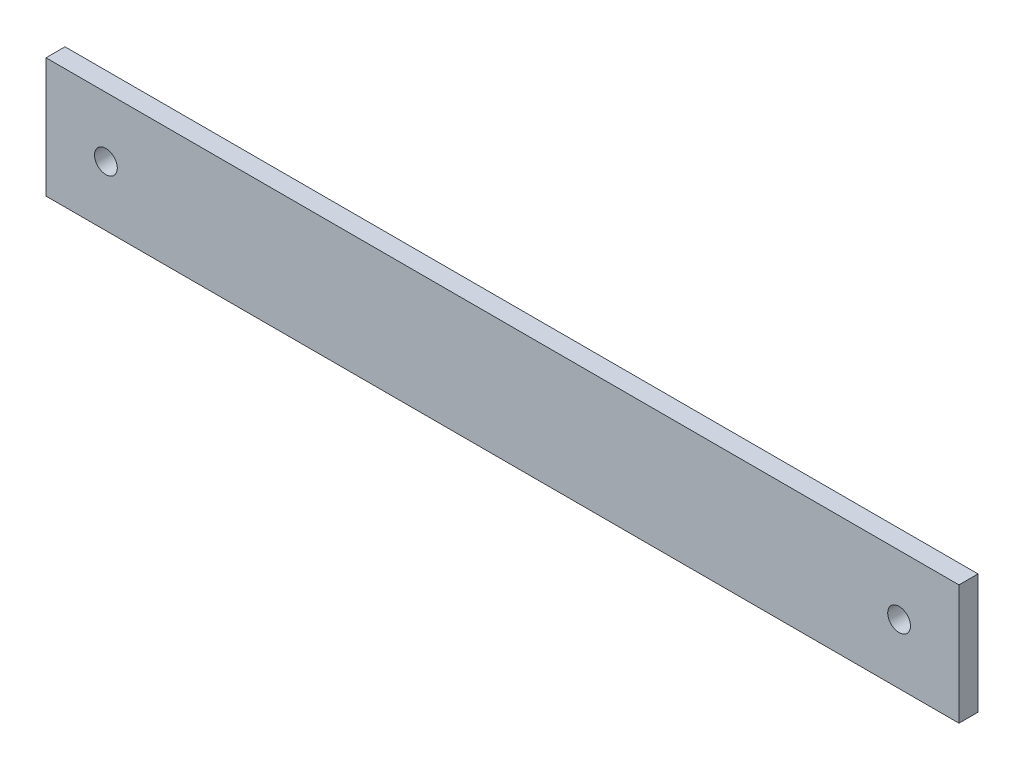
ISO-10303-21;
HEADER;
FILE_DESCRIPTION(('STEP AP214'),'2;1');
FILE_NAME('part.step','',(''),(''),'','','');
FILE_SCHEMA(('AUTOMOTIVE_DESIGN { 1 0 10303 214 1 1 1 1 }'));
ENDSEC;
DATA;
#1=APPLICATION_CONTEXT('core data for automotive mechanical design processes');
#2=APPLICATION_PROTOCOL_DEFINITION('international standard','automotive_design',2000,#1);
#3=PRODUCT_CONTEXT('',#1,'mechanical');
#4=PRODUCT('Part','Part','',(#3));
#5=PRODUCT_RELATED_PRODUCT_CATEGORY('part','',(#4));
#6=PRODUCT_DEFINITION_FORMATION('','',#4);
#7=PRODUCT_DEFINITION_CONTEXT('part definition',#1,'design');
#8=PRODUCT_DEFINITION('design','',#6,#7);
#9=PRODUCT_DEFINITION_SHAPE('','',#8);
#10=(LENGTH_UNIT() NAMED_UNIT(*) SI_UNIT(.MILLI.,.METRE.));
#11=(NAMED_UNIT(*) PLANE_ANGLE_UNIT() SI_UNIT($,.RADIAN.));
#12=(NAMED_UNIT(*) SI_UNIT($,.STERADIAN.) SOLID_ANGLE_UNIT());
#13=UNCERTAINTY_MEASURE_WITH_UNIT(LENGTH_MEASURE(1.E-05),#10,'distance_accuracy_value','');
#14=(GEOMETRIC_REPRESENTATION_CONTEXT(3) GLOBAL_UNCERTAINTY_ASSIGNED_CONTEXT((#13)) GLOBAL_UNIT_ASSIGNED_CONTEXT((#10,
#11,#12)) REPRESENTATION_CONTEXT('',''));
#15=CARTESIAN_POINT('',(0.,0.,0.));
#16=DIRECTION('',(0.,0.,1.));
#17=DIRECTION('',(1.,0.,0.));
#18=AXIS2_PLACEMENT_3D('',#15,#16,#17);
#19=CARTESIAN_POINT('',(0.,0.,3.175));
#20=DIRECTION('',(0.,0.,-1.));
#21=DIRECTION('',(-1.,0.,0.));
#22=AXIS2_PLACEMENT_3D('',#19,#20,#21);
#23=PLANE('',#22);
#24=CARTESIAN_POINT('',(142.4,10.,3.175));
#25=DIRECTION('',(0.,0.,-1.));
#26=DIRECTION('',(-1.,0.,0.));
#27=AXIS2_PLACEMENT_3D('',#24,#25,#26);
#28=CIRCLE('',#27,1.89865);
#29=CARTESIAN_POINT('',(140.50135,10.,3.175));
#30=VERTEX_POINT('',#29);
#31=EDGE_CURVE('E114',#30,#30,#28,.F.);
#32=ORIENTED_EDGE('',*,*,#31,.F.);
#33=EDGE_LOOP('',(#32));
#34=FACE_BOUND('',#33,.T.);
#35=DIRECTION('',(0.,-1.,0.));
#36=VECTOR('',#35,1.);
#37=CARTESIAN_POINT('',(0.,0.,3.175));
#38=LINE('',#37,#36);
#39=CARTESIAN_POINT('',(0.,20.,3.175));
#40=VERTEX_POINT('',#39);
#41=CARTESIAN_POINT('',(0.,0.,3.175));
#42=VERTEX_POINT('',#41);
#43=EDGE_CURVE('E85',#40,#42,#38,.T.);
#44=ORIENTED_EDGE('',*,*,#43,.T.);
#45=DIRECTION('',(1.,0.,0.));
#46=VECTOR('',#45,1.);
#47=CARTESIAN_POINT('',(0.,0.,3.175));
#48=LINE('',#47,#46);
#49=CARTESIAN_POINT('',(152.4,0.,3.175));
#50=VERTEX_POINT('',#49);
#51=EDGE_CURVE('E80',#42,#50,#48,.T.);
#52=ORIENTED_EDGE('',*,*,#51,.T.);
#53=DIRECTION('',(0.,1.,0.));
#54=VECTOR('',#53,1.);
#55=CARTESIAN_POINT('',(152.4,0.,3.175));
#56=LINE('',#55,#54);
#57=CARTESIAN_POINT('',(152.4,20.,3.175));
#58=VERTEX_POINT('',#57);
#59=EDGE_CURVE('E83',#50,#58,#56,.T.);
#60=ORIENTED_EDGE('',*,*,#59,.T.);
#61=DIRECTION('',(-1.,0.,0.));
#62=VECTOR('',#61,1.);
#63=CARTESIAN_POINT('',(0.,20.,3.175));
#64=LINE('',#63,#62);
#65=EDGE_CURVE('E50',#58,#40,#64,.T.);
#66=ORIENTED_EDGE('',*,*,#65,.T.);
#67=EDGE_LOOP('',(#44,#52,#60,#66));
#68=FACE_BOUND('',#67,.T.);
#69=CARTESIAN_POINT('',(10.,10.,3.175));
#70=DIRECTION('',(0.,0.,-1.));
#71=DIRECTION('',(-1.,0.,0.));
#72=AXIS2_PLACEMENT_3D('',#69,#70,#71);
#73=CIRCLE('',#72,1.89864999999999);
#74=CARTESIAN_POINT('',(8.10135000000001,10.,3.175));
#75=VERTEX_POINT('',#74);
#76=EDGE_CURVE('E100',#75,#75,#73,.F.);
#77=ORIENTED_EDGE('',*,*,#76,.F.);
#78=EDGE_LOOP('',(#77));
#79=FACE_BOUND('',#78,.T.);
#80=ADVANCED_FACE('F33',(#34,#68,#79),#23,.F.);
#81=CARTESIAN_POINT('',(0.,0.,3.175));
#82=DIRECTION('',(1.,0.,0.));
#83=DIRECTION('',(0.,0.,-1.));
#84=AXIS2_PLACEMENT_3D('',#81,#82,#83);
#85=PLANE('',#84);
#86=DIRECTION('',(0.,-1.,0.));
#87=VECTOR('',#86,1.);
#88=CARTESIAN_POINT('',(0.,0.,0.));
#89=LINE('',#88,#87);
#90=CARTESIAN_POINT('',(0.,20.,0.));
#91=VERTEX_POINT('',#90);
#92=CARTESIAN_POINT('',(0.,0.,0.));
#93=VERTEX_POINT('',#92);
#94=EDGE_CURVE('E97',#91,#93,#89,.T.);
#95=ORIENTED_EDGE('',*,*,#94,.T.);
#96=DIRECTION('',(0.,0.,-1.));
#97=VECTOR('',#96,1.);
#98=CARTESIAN_POINT('',(0.,0.,3.175));
#99=LINE('',#98,#97);
#100=EDGE_CURVE('E11',#42,#93,#99,.T.);
#101=ORIENTED_EDGE('',*,*,#100,.F.);
#102=ORIENTED_EDGE('',*,*,#43,.F.);
#103=DIRECTION('',(0.,0.,-1.));
#104=VECTOR('',#103,1.);
#105=CARTESIAN_POINT('',(0.,20.,3.175));
#106=LINE('',#105,#104);
#107=EDGE_CURVE('E93',#40,#91,#106,.T.);
#108=ORIENTED_EDGE('',*,*,#107,.T.);
#109=EDGE_LOOP('',(#95,#101,#102,#108));
#110=FACE_BOUND('',#109,.T.);
#111=ADVANCED_FACE('F35',(#110),#85,.F.);
#112=CARTESIAN_POINT('',(0.,0.,3.175));
#113=DIRECTION('',(0.,1.,0.));
#114=DIRECTION('',(0.,0.,1.));
#115=AXIS2_PLACEMENT_3D('',#112,#113,#114);
#116=PLANE('',#115);
#117=DIRECTION('',(1.,0.,0.));
#118=VECTOR('',#117,1.);
#119=CARTESIAN_POINT('',(0.,0.,0.));
#120=LINE('',#119,#118);
#121=CARTESIAN_POINT('',(152.4,0.,0.));
#122=VERTEX_POINT('',#121);
#123=EDGE_CURVE('E89',#93,#122,#120,.T.);
#124=ORIENTED_EDGE('',*,*,#123,.T.);
#125=DIRECTION('',(0.,0.,-1.));
#126=VECTOR('',#125,1.);
#127=CARTESIAN_POINT('',(152.4,0.,3.175));
#128=LINE('',#127,#126);
#129=EDGE_CURVE('E42',#50,#122,#128,.T.);
#130=ORIENTED_EDGE('',*,*,#129,.F.);
#131=ORIENTED_EDGE('',*,*,#51,.F.);
#132=ORIENTED_EDGE('',*,*,#100,.T.);
#133=EDGE_LOOP('',(#124,#130,#131,#132));
#134=FACE_BOUND('',#133,.T.);
#135=ADVANCED_FACE('F88',(#134),#116,.F.);
#136=CARTESIAN_POINT('',(152.4,0.,3.175));
#137=DIRECTION('',(-1.,0.,0.));
#138=DIRECTION('',(0.,0.,1.));
#139=AXIS2_PLACEMENT_3D('',#136,#137,#138);
#140=PLANE('',#139);
#141=DIRECTION('',(0.,1.,0.));
#142=VECTOR('',#141,1.);
#143=CARTESIAN_POINT('',(152.4,0.,0.));
#144=LINE('',#143,#142);
#145=CARTESIAN_POINT('',(152.4,20.,0.));
#146=VERTEX_POINT('',#145);
#147=EDGE_CURVE('E67',#122,#146,#144,.T.);
#148=ORIENTED_EDGE('',*,*,#147,.T.);
#149=DIRECTION('',(0.,0.,-1.));
#150=VECTOR('',#149,1.);
#151=CARTESIAN_POINT('',(152.4,20.,3.175));
#152=LINE('',#151,#150);
#153=EDGE_CURVE('E90',#58,#146,#152,.T.);
#154=ORIENTED_EDGE('',*,*,#153,.F.);
#155=ORIENTED_EDGE('',*,*,#59,.F.);
#156=ORIENTED_EDGE('',*,*,#129,.T.);
#157=EDGE_LOOP('',(#148,#154,#155,#156));
#158=FACE_BOUND('',#157,.T.);
#159=ADVANCED_FACE('F91',(#158),#140,.F.);
#160=CARTESIAN_POINT('',(0.,20.,3.175));
#161=DIRECTION('',(0.,-1.,0.));
#162=DIRECTION('',(0.,0.,-1.));
#163=AXIS2_PLACEMENT_3D('',#160,#161,#162);
#164=PLANE('',#163);
#165=DIRECTION('',(-1.,0.,0.));
#166=VECTOR('',#165,1.);
#167=CARTESIAN_POINT('',(0.,20.,0.));
#168=LINE('',#167,#166);
#169=EDGE_CURVE('E73',#146,#91,#168,.T.);
#170=ORIENTED_EDGE('',*,*,#169,.T.);
#171=ORIENTED_EDGE('',*,*,#107,.F.);
#172=ORIENTED_EDGE('',*,*,#65,.F.);
#173=ORIENTED_EDGE('',*,*,#153,.T.);
#174=EDGE_LOOP('',(#170,#171,#172,#173));
#175=FACE_BOUND('',#174,.T.);
#176=ADVANCED_FACE('F105',(#175),#164,.F.);
#177=CARTESIAN_POINT('',(0.,0.,0.));
#178=DIRECTION('',(0.,0.,-1.));
#179=DIRECTION('',(-1.,0.,0.));
#180=AXIS2_PLACEMENT_3D('',#177,#178,#179);
#181=PLANE('',#180);
#182=CARTESIAN_POINT('',(142.4,10.,0.));
#183=DIRECTION('',(0.,0.,-1.));
#184=DIRECTION('',(-1.,0.,0.));
#185=AXIS2_PLACEMENT_3D('',#182,#183,#184);
#186=CIRCLE('',#185,1.89865);
#187=CARTESIAN_POINT('',(140.50135,10.,0.));
#188=VERTEX_POINT('',#187);
#189=EDGE_CURVE('E117',#188,#188,#186,.T.);
#190=ORIENTED_EDGE('',*,*,#189,.F.);
#191=EDGE_LOOP('',(#190));
#192=FACE_BOUND('',#191,.T.);
#193=CARTESIAN_POINT('',(10.,10.,0.));
#194=DIRECTION('',(0.,0.,-1.));
#195=DIRECTION('',(-1.,0.,0.));
#196=AXIS2_PLACEMENT_3D('',#193,#194,#195);
#197=CIRCLE('',#196,1.89864999999999);
#198=CARTESIAN_POINT('',(8.10135000000002,10.,0.));
#199=VERTEX_POINT('',#198);
#200=EDGE_CURVE('E111',#199,#199,#197,.T.);
#201=ORIENTED_EDGE('',*,*,#200,.F.);
#202=EDGE_LOOP('',(#201));
#203=FACE_BOUND('',#202,.T.);
#204=ORIENTED_EDGE('',*,*,#94,.F.);
#205=ORIENTED_EDGE('',*,*,#169,.F.);
#206=ORIENTED_EDGE('',*,*,#147,.F.);
#207=ORIENTED_EDGE('',*,*,#123,.F.);
#208=EDGE_LOOP('',(#204,#205,#206,#207));
#209=FACE_BOUND('',#208,.T.);
#210=ADVANCED_FACE('F108',(#192,#203,#209),#181,.T.);
#211=CARTESIAN_POINT('',(10.,10.,0.));
#212=DIRECTION('',(0.,0.,-1.));
#213=DIRECTION('',(-1.,0.,0.));
#214=AXIS2_PLACEMENT_3D('',#211,#212,#213);
#215=CYLINDRICAL_SURFACE('',#214,1.89864999999999);
#216=ORIENTED_EDGE('',*,*,#76,.T.);
#217=EDGE_LOOP('',(#216));
#218=FACE_BOUND('',#217,.T.);
#219=ORIENTED_EDGE('',*,*,#200,.T.);
#220=EDGE_LOOP('',(#219));
#221=FACE_BOUND('',#220,.T.);
#222=ADVANCED_FACE('F133',(#218,#221),#215,.F.);
#223=CARTESIAN_POINT('',(142.4,10.,0.));
#224=DIRECTION('',(0.,0.,-1.));
#225=DIRECTION('',(-1.,0.,0.));
#226=AXIS2_PLACEMENT_3D('',#223,#224,#225);
#227=CYLINDRICAL_SURFACE('',#226,1.89865);
#228=ORIENTED_EDGE('',*,*,#31,.T.);
#229=EDGE_LOOP('',(#228));
#230=FACE_BOUND('',#229,.T.);
#231=ORIENTED_EDGE('',*,*,#189,.T.);
#232=EDGE_LOOP('',(#231));
#233=FACE_BOUND('',#232,.T.);
#234=ADVANCED_FACE('F123',(#230,#233),#227,.F.);
#235=CLOSED_SHELL('',(#80,#111,#135,#159,#176,#210,#222,#234));
#236=MANIFOLD_SOLID_BREP('B2',#235);
#237=ADVANCED_BREP_SHAPE_REPRESENTATION('',(#18,#236),#14);
#238=SHAPE_DEFINITION_REPRESENTATION(#9,#237);
ENDSEC;
END-ISO-10303-21;
